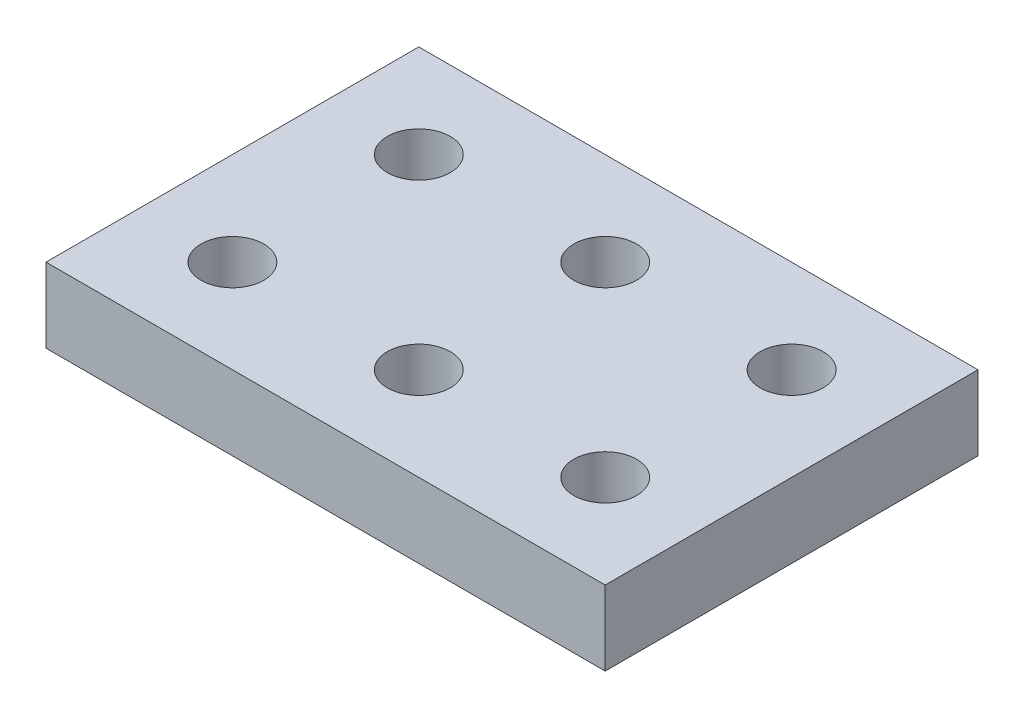
ISO-10303-21;
HEADER;
FILE_DESCRIPTION(('STEP AP214'),'2;1');
FILE_NAME('part.step','',(''),(''),'','','');
FILE_SCHEMA(('AUTOMOTIVE_DESIGN { 1 0 10303 214 1 1 1 1 }'));
ENDSEC;
DATA;
#1=APPLICATION_CONTEXT('core data for automotive mechanical design processes');
#2=APPLICATION_PROTOCOL_DEFINITION('international standard','automotive_design',2000,#1);
#3=PRODUCT_CONTEXT('',#1,'mechanical');
#4=PRODUCT('Part','Part','',(#3));
#5=PRODUCT_RELATED_PRODUCT_CATEGORY('part','',(#4));
#6=PRODUCT_DEFINITION_FORMATION('','',#4);
#7=PRODUCT_DEFINITION_CONTEXT('part definition',#1,'design');
#8=PRODUCT_DEFINITION('design','',#6,#7);
#9=PRODUCT_DEFINITION_SHAPE('','',#8);
#10=(LENGTH_UNIT() NAMED_UNIT(*) SI_UNIT(.MILLI.,.METRE.));
#11=(NAMED_UNIT(*) PLANE_ANGLE_UNIT() SI_UNIT($,.RADIAN.));
#12=(NAMED_UNIT(*) SI_UNIT($,.STERADIAN.) SOLID_ANGLE_UNIT());
#13=UNCERTAINTY_MEASURE_WITH_UNIT(LENGTH_MEASURE(1.E-05),#10,'distance_accuracy_value','');
#14=(GEOMETRIC_REPRESENTATION_CONTEXT(3) GLOBAL_UNCERTAINTY_ASSIGNED_CONTEXT((#13)) GLOBAL_UNIT_ASSIGNED_CONTEXT((#10,
#11,#12)) REPRESENTATION_CONTEXT('',''));
#15=CARTESIAN_POINT('',(0.,0.,0.));
#16=DIRECTION('',(0.,0.,1.));
#17=DIRECTION('',(1.,0.,0.));
#18=AXIS2_PLACEMENT_3D('',#15,#16,#17);
#19=CARTESIAN_POINT('',(0.,32.,0.));
#20=DIRECTION('',(1.,0.,0.));
#21=DIRECTION('',(0.,0.,-1.));
#22=AXIS2_PLACEMENT_3D('',#19,#20,#21);
#23=PLANE('',#22);
#24=DIRECTION('',(0.,0.,1.));
#25=VECTOR('',#24,1.);
#26=CARTESIAN_POINT('',(0.,0.,0.));
#27=LINE('',#26,#25);
#28=CARTESIAN_POINT('',(0.,0.,-160.));
#29=VERTEX_POINT('',#28);
#30=CARTESIAN_POINT('',(0.,0.,0.));
#31=VERTEX_POINT('',#30);
#32=EDGE_CURVE('E97',#29,#31,#27,.T.);
#33=ORIENTED_EDGE('',*,*,#32,.T.);
#34=DIRECTION('',(0.,-1.,0.));
#35=VECTOR('',#34,1.);
#36=CARTESIAN_POINT('',(0.,32.,0.));
#37=LINE('',#36,#35);
#38=CARTESIAN_POINT('',(0.,32.,0.));
#39=VERTEX_POINT('',#38);
#40=EDGE_CURVE('E11',#39,#31,#37,.T.);
#41=ORIENTED_EDGE('',*,*,#40,.F.);
#42=DIRECTION('',(0.,0.,1.));
#43=VECTOR('',#42,1.);
#44=CARTESIAN_POINT('',(0.,32.,0.));
#45=LINE('',#44,#43);
#46=CARTESIAN_POINT('',(0.,32.,-160.));
#47=VERTEX_POINT('',#46);
#48=EDGE_CURVE('E85',#47,#39,#45,.T.);
#49=ORIENTED_EDGE('',*,*,#48,.F.);
#50=DIRECTION('',(0.,-1.,0.));
#51=VECTOR('',#50,1.);
#52=CARTESIAN_POINT('',(0.,32.,-160.));
#53=LINE('',#52,#51);
#54=EDGE_CURVE('E93',#47,#29,#53,.T.);
#55=ORIENTED_EDGE('',*,*,#54,.T.);
#56=EDGE_LOOP('',(#33,#41,#49,#55));
#57=FACE_BOUND('',#56,.T.);
#58=ADVANCED_FACE('F34',(#57),#23,.F.);
#59=CARTESIAN_POINT('',(0.,32.,0.));
#60=DIRECTION('',(0.,0.,-1.));
#61=DIRECTION('',(-1.,0.,0.));
#62=AXIS2_PLACEMENT_3D('',#59,#60,#61);
#63=PLANE('',#62);
#64=DIRECTION('',(1.,0.,0.));
#65=VECTOR('',#64,1.);
#66=CARTESIAN_POINT('',(0.,0.,0.));
#67=LINE('',#66,#65);
#68=CARTESIAN_POINT('',(240.,0.,0.));
#69=VERTEX_POINT('',#68);
#70=EDGE_CURVE('E89',#31,#69,#67,.T.);
#71=ORIENTED_EDGE('',*,*,#70,.T.);
#72=DIRECTION('',(0.,-1.,0.));
#73=VECTOR('',#72,1.);
#74=CARTESIAN_POINT('',(240.,32.,0.));
#75=LINE('',#74,#73);
#76=CARTESIAN_POINT('',(240.,32.,0.));
#77=VERTEX_POINT('',#76);
#78=EDGE_CURVE('E42',#77,#69,#75,.T.);
#79=ORIENTED_EDGE('',*,*,#78,.F.);
#80=DIRECTION('',(1.,0.,0.));
#81=VECTOR('',#80,1.);
#82=CARTESIAN_POINT('',(0.,32.,0.));
#83=LINE('',#82,#81);
#84=EDGE_CURVE('E80',#39,#77,#83,.T.);
#85=ORIENTED_EDGE('',*,*,#84,.F.);
#86=ORIENTED_EDGE('',*,*,#40,.T.);
#87=EDGE_LOOP('',(#71,#79,#85,#86));
#88=FACE_BOUND('',#87,.T.);
#89=ADVANCED_FACE('F88',(#88),#63,.F.);
#90=CARTESIAN_POINT('',(240.,32.,0.));
#91=DIRECTION('',(-1.,0.,0.));
#92=DIRECTION('',(0.,0.,1.));
#93=AXIS2_PLACEMENT_3D('',#90,#91,#92);
#94=PLANE('',#93);
#95=DIRECTION('',(0.,0.,-1.));
#96=VECTOR('',#95,1.);
#97=CARTESIAN_POINT('',(240.,0.,0.));
#98=LINE('',#97,#96);
#99=CARTESIAN_POINT('',(240.,0.,-160.));
#100=VERTEX_POINT('',#99);
#101=EDGE_CURVE('E67',#69,#100,#98,.T.);
#102=ORIENTED_EDGE('',*,*,#101,.T.);
#103=DIRECTION('',(0.,-1.,0.));
#104=VECTOR('',#103,1.);
#105=CARTESIAN_POINT('',(240.,32.,-160.));
#106=LINE('',#105,#104);
#107=CARTESIAN_POINT('',(240.,32.,-160.));
#108=VERTEX_POINT('',#107);
#109=EDGE_CURVE('E90',#108,#100,#106,.T.);
#110=ORIENTED_EDGE('',*,*,#109,.F.);
#111=DIRECTION('',(0.,0.,-1.));
#112=VECTOR('',#111,1.);
#113=CARTESIAN_POINT('',(240.,32.,0.));
#114=LINE('',#113,#112);
#115=EDGE_CURVE('E83',#77,#108,#114,.T.);
#116=ORIENTED_EDGE('',*,*,#115,.F.);
#117=ORIENTED_EDGE('',*,*,#78,.T.);
#118=EDGE_LOOP('',(#102,#110,#116,#117));
#119=FACE_BOUND('',#118,.T.);
#120=ADVANCED_FACE('F91',(#119),#94,.F.);
#121=CARTESIAN_POINT('',(0.,32.,-160.));
#122=DIRECTION('',(0.,0.,1.));
#123=DIRECTION('',(1.,0.,0.));
#124=AXIS2_PLACEMENT_3D('',#121,#122,#123);
#125=PLANE('',#124);
#126=DIRECTION('',(-1.,0.,0.));
#127=VECTOR('',#126,1.);
#128=CARTESIAN_POINT('',(0.,0.,-160.));
#129=LINE('',#128,#127);
#130=EDGE_CURVE('E73',#100,#29,#129,.T.);
#131=ORIENTED_EDGE('',*,*,#130,.T.);
#132=ORIENTED_EDGE('',*,*,#54,.F.);
#133=DIRECTION('',(-1.,0.,0.));
#134=VECTOR('',#133,1.);
#135=CARTESIAN_POINT('',(0.,32.,-160.));
#136=LINE('',#135,#134);
#137=EDGE_CURVE('E50',#108,#47,#136,.T.);
#138=ORIENTED_EDGE('',*,*,#137,.F.);
#139=ORIENTED_EDGE('',*,*,#109,.T.);
#140=EDGE_LOOP('',(#131,#132,#138,#139));
#141=FACE_BOUND('',#140,.T.);
#142=ADVANCED_FACE('F105',(#141),#125,.F.);
#143=CARTESIAN_POINT('',(0.,32.,0.));
#144=DIRECTION('',(0.,-1.,0.));
#145=DIRECTION('',(0.,0.,-1.));
#146=AXIS2_PLACEMENT_3D('',#143,#144,#145);
#147=PLANE('',#146);
#148=CARTESIAN_POINT('',(200.,32.,-40.));
#149=DIRECTION('',(0.,1.,0.));
#150=DIRECTION('',(0.,0.,1.));
#151=AXIS2_PLACEMENT_3D('',#148,#149,#150);
#152=CIRCLE('',#151,13.5);
#153=CARTESIAN_POINT('',(200.,32.,-26.5));
#154=VERTEX_POINT('',#153);
#155=EDGE_CURVE('E141',#154,#154,#152,.T.);
#156=ORIENTED_EDGE('',*,*,#155,.F.);
#157=EDGE_LOOP('',(#156));
#158=FACE_BOUND('',#157,.T.);
#159=CARTESIAN_POINT('',(40.0000000000001,32.,-40.));
#160=DIRECTION('',(0.,1.,0.));
#161=DIRECTION('',(0.,0.,1.));
#162=AXIS2_PLACEMENT_3D('',#159,#160,#161);
#163=CIRCLE('',#162,13.5);
#164=CARTESIAN_POINT('',(40.0000000000001,32.,-26.5));
#165=VERTEX_POINT('',#164);
#166=EDGE_CURVE('E135',#165,#165,#163,.T.);
#167=ORIENTED_EDGE('',*,*,#166,.F.);
#168=EDGE_LOOP('',(#167));
#169=FACE_BOUND('',#168,.T.);
#170=CARTESIAN_POINT('',(120.,32.,-40.));
#171=DIRECTION('',(0.,1.,0.));
#172=DIRECTION('',(0.,0.,1.));
#173=AXIS2_PLACEMENT_3D('',#170,#171,#172);
#174=CIRCLE('',#173,13.5);
#175=CARTESIAN_POINT('',(120.,32.,-26.5));
#176=VERTEX_POINT('',#175);
#177=EDGE_CURVE('E129',#176,#176,#174,.T.);
#178=ORIENTED_EDGE('',*,*,#177,.F.);
#179=EDGE_LOOP('',(#178));
#180=FACE_BOUND('',#179,.T.);
#181=CARTESIAN_POINT('',(200.,32.,-120.));
#182=DIRECTION('',(0.,1.,0.));
#183=DIRECTION('',(0.,0.,1.));
#184=AXIS2_PLACEMENT_3D('',#181,#182,#183);
#185=CIRCLE('',#184,13.5);
#186=CARTESIAN_POINT('',(200.,32.,-106.5));
#187=VERTEX_POINT('',#186);
#188=EDGE_CURVE('E123',#187,#187,#185,.T.);
#189=ORIENTED_EDGE('',*,*,#188,.F.);
#190=EDGE_LOOP('',(#189));
#191=FACE_BOUND('',#190,.T.);
#192=CARTESIAN_POINT('',(40.0000000000001,32.,-120.));
#193=DIRECTION('',(0.,1.,0.));
#194=DIRECTION('',(0.,0.,1.));
#195=AXIS2_PLACEMENT_3D('',#192,#193,#194);
#196=CIRCLE('',#195,13.5);
#197=CARTESIAN_POINT('',(40.0000000000001,32.,-106.5));
#198=VERTEX_POINT('',#197);
#199=EDGE_CURVE('E117',#198,#198,#196,.T.);
#200=ORIENTED_EDGE('',*,*,#199,.F.);
#201=EDGE_LOOP('',(#200));
#202=FACE_BOUND('',#201,.T.);
#203=CARTESIAN_POINT('',(120.,32.,-120.));
#204=DIRECTION('',(0.,1.,0.));
#205=DIRECTION('',(0.,0.,1.));
#206=AXIS2_PLACEMENT_3D('',#203,#204,#205);
#207=CIRCLE('',#206,13.5);
#208=CARTESIAN_POINT('',(120.,32.,-106.5));
#209=VERTEX_POINT('',#208);
#210=EDGE_CURVE('E111',#209,#209,#207,.T.);
#211=ORIENTED_EDGE('',*,*,#210,.F.);
#212=EDGE_LOOP('',(#211));
#213=FACE_BOUND('',#212,.T.);
#214=ORIENTED_EDGE('',*,*,#48,.T.);
#215=ORIENTED_EDGE('',*,*,#84,.T.);
#216=ORIENTED_EDGE('',*,*,#115,.T.);
#217=ORIENTED_EDGE('',*,*,#137,.T.);
#218=EDGE_LOOP('',(#214,#215,#216,#217));
#219=FACE_BOUND('',#218,.T.);
#220=ADVANCED_FACE('F81',(#158,#169,#180,#191,#202,#213,#219),#147,.F.);
#221=CARTESIAN_POINT('',(0.,0.,0.));
#222=DIRECTION('',(0.,-1.,0.));
#223=DIRECTION('',(0.,0.,-1.));
#224=AXIS2_PLACEMENT_3D('',#221,#222,#223);
#225=PLANE('',#224);
#226=CARTESIAN_POINT('',(200.,0.,-40.));
#227=DIRECTION('',(0.,1.,0.));
#228=DIRECTION('',(0.,0.,1.));
#229=AXIS2_PLACEMENT_3D('',#226,#227,#228);
#230=CIRCLE('',#229,13.5);
#231=CARTESIAN_POINT('',(200.,0.,-26.5));
#232=VERTEX_POINT('',#231);
#233=EDGE_CURVE('E138',#232,#232,#230,.T.);
#234=ORIENTED_EDGE('',*,*,#233,.T.);
#235=EDGE_LOOP('',(#234));
#236=FACE_BOUND('',#235,.T.);
#237=CARTESIAN_POINT('',(40.0000000000001,0.,-40.));
#238=DIRECTION('',(0.,1.,0.));
#239=DIRECTION('',(0.,0.,1.));
#240=AXIS2_PLACEMENT_3D('',#237,#238,#239);
#241=CIRCLE('',#240,13.5);
#242=CARTESIAN_POINT('',(40.0000000000001,0.,-26.5));
#243=VERTEX_POINT('',#242);
#244=EDGE_CURVE('E132',#243,#243,#241,.T.);
#245=ORIENTED_EDGE('',*,*,#244,.T.);
#246=EDGE_LOOP('',(#245));
#247=FACE_BOUND('',#246,.T.);
#248=CARTESIAN_POINT('',(120.,0.,-40.));
#249=DIRECTION('',(0.,1.,0.));
#250=DIRECTION('',(0.,0.,1.));
#251=AXIS2_PLACEMENT_3D('',#248,#249,#250);
#252=CIRCLE('',#251,13.5);
#253=CARTESIAN_POINT('',(120.,0.,-26.5));
#254=VERTEX_POINT('',#253);
#255=EDGE_CURVE('E126',#254,#254,#252,.T.);
#256=ORIENTED_EDGE('',*,*,#255,.T.);
#257=EDGE_LOOP('',(#256));
#258=FACE_BOUND('',#257,.T.);
#259=CARTESIAN_POINT('',(200.,0.,-120.));
#260=DIRECTION('',(0.,1.,0.));
#261=DIRECTION('',(0.,0.,1.));
#262=AXIS2_PLACEMENT_3D('',#259,#260,#261);
#263=CIRCLE('',#262,13.5);
#264=CARTESIAN_POINT('',(200.,0.,-106.5));
#265=VERTEX_POINT('',#264);
#266=EDGE_CURVE('E120',#265,#265,#263,.T.);
#267=ORIENTED_EDGE('',*,*,#266,.T.);
#268=EDGE_LOOP('',(#267));
#269=FACE_BOUND('',#268,.T.);
#270=CARTESIAN_POINT('',(40.0000000000001,0.,-120.));
#271=DIRECTION('',(0.,1.,0.));
#272=DIRECTION('',(0.,0.,1.));
#273=AXIS2_PLACEMENT_3D('',#270,#271,#272);
#274=CIRCLE('',#273,13.5);
#275=CARTESIAN_POINT('',(40.0000000000001,0.,-106.5));
#276=VERTEX_POINT('',#275);
#277=EDGE_CURVE('E114',#276,#276,#274,.T.);
#278=ORIENTED_EDGE('',*,*,#277,.T.);
#279=EDGE_LOOP('',(#278));
#280=FACE_BOUND('',#279,.T.);
#281=CARTESIAN_POINT('',(120.,0.,-120.));
#282=DIRECTION('',(0.,1.,0.));
#283=DIRECTION('',(0.,0.,1.));
#284=AXIS2_PLACEMENT_3D('',#281,#282,#283);
#285=CIRCLE('',#284,13.5);
#286=CARTESIAN_POINT('',(120.,0.,-106.5));
#287=VERTEX_POINT('',#286);
#288=EDGE_CURVE('E100',#287,#287,#285,.T.);
#289=ORIENTED_EDGE('',*,*,#288,.T.);
#290=EDGE_LOOP('',(#289));
#291=FACE_BOUND('',#290,.T.);
#292=ORIENTED_EDGE('',*,*,#32,.F.);
#293=ORIENTED_EDGE('',*,*,#130,.F.);
#294=ORIENTED_EDGE('',*,*,#101,.F.);
#295=ORIENTED_EDGE('',*,*,#70,.F.);
#296=EDGE_LOOP('',(#292,#293,#294,#295));
#297=FACE_BOUND('',#296,.T.);
#298=ADVANCED_FACE('F108',(#236,#247,#258,#269,#280,#291,#297),#225,.T.);
#299=CARTESIAN_POINT('',(120.,0.,-120.));
#300=DIRECTION('',(0.,1.,0.));
#301=DIRECTION('',(0.,0.,1.));
#302=AXIS2_PLACEMENT_3D('',#299,#300,#301);
#303=CYLINDRICAL_SURFACE('',#302,13.5);
#304=ORIENTED_EDGE('',*,*,#288,.F.);
#305=EDGE_LOOP('',(#304));
#306=FACE_BOUND('',#305,.T.);
#307=ORIENTED_EDGE('',*,*,#210,.T.);
#308=EDGE_LOOP('',(#307));
#309=FACE_BOUND('',#308,.T.);
#310=ADVANCED_FACE('F169',(#306,#309),#303,.F.);
#311=CARTESIAN_POINT('',(40.0000000000001,0.,-120.));
#312=DIRECTION('',(0.,1.,0.));
#313=DIRECTION('',(0.,0.,1.));
#314=AXIS2_PLACEMENT_3D('',#311,#312,#313);
#315=CYLINDRICAL_SURFACE('',#314,13.5);
#316=ORIENTED_EDGE('',*,*,#277,.F.);
#317=EDGE_LOOP('',(#316));
#318=FACE_BOUND('',#317,.T.);
#319=ORIENTED_EDGE('',*,*,#199,.T.);
#320=EDGE_LOOP('',(#319));
#321=FACE_BOUND('',#320,.T.);
#322=ADVANCED_FACE('F171',(#318,#321),#315,.F.);
#323=CARTESIAN_POINT('',(200.,0.,-120.));
#324=DIRECTION('',(0.,1.,0.));
#325=DIRECTION('',(0.,0.,1.));
#326=AXIS2_PLACEMENT_3D('',#323,#324,#325);
#327=CYLINDRICAL_SURFACE('',#326,13.5);
#328=ORIENTED_EDGE('',*,*,#266,.F.);
#329=EDGE_LOOP('',(#328));
#330=FACE_BOUND('',#329,.T.);
#331=ORIENTED_EDGE('',*,*,#188,.T.);
#332=EDGE_LOOP('',(#331));
#333=FACE_BOUND('',#332,.T.);
#334=ADVANCED_FACE('F178',(#330,#333),#327,.F.);
#335=CARTESIAN_POINT('',(120.,0.,-40.));
#336=DIRECTION('',(0.,1.,0.));
#337=DIRECTION('',(0.,0.,1.));
#338=AXIS2_PLACEMENT_3D('',#335,#336,#337);
#339=CYLINDRICAL_SURFACE('',#338,13.5);
#340=ORIENTED_EDGE('',*,*,#255,.F.);
#341=EDGE_LOOP('',(#340));
#342=FACE_BOUND('',#341,.T.);
#343=ORIENTED_EDGE('',*,*,#177,.T.);
#344=EDGE_LOOP('',(#343));
#345=FACE_BOUND('',#344,.T.);
#346=ADVANCED_FACE('F212',(#342,#345),#339,.F.);
#347=CARTESIAN_POINT('',(40.0000000000001,0.,-40.));
#348=DIRECTION('',(0.,1.,0.));
#349=DIRECTION('',(0.,0.,1.));
#350=AXIS2_PLACEMENT_3D('',#347,#348,#349);
#351=CYLINDRICAL_SURFACE('',#350,13.5);
#352=ORIENTED_EDGE('',*,*,#244,.F.);
#353=EDGE_LOOP('',(#352));
#354=FACE_BOUND('',#353,.T.);
#355=ORIENTED_EDGE('',*,*,#166,.T.);
#356=EDGE_LOOP('',(#355));
#357=FACE_BOUND('',#356,.T.);
#358=ADVANCED_FACE('F152',(#354,#357),#351,.F.);
#359=CARTESIAN_POINT('',(200.,0.,-40.));
#360=DIRECTION('',(0.,1.,0.));
#361=DIRECTION('',(0.,0.,1.));
#362=AXIS2_PLACEMENT_3D('',#359,#360,#361);
#363=CYLINDRICAL_SURFACE('',#362,13.5);
#364=ORIENTED_EDGE('',*,*,#233,.F.);
#365=EDGE_LOOP('',(#364));
#366=FACE_BOUND('',#365,.T.);
#367=ORIENTED_EDGE('',*,*,#155,.T.);
#368=EDGE_LOOP('',(#367));
#369=FACE_BOUND('',#368,.T.);
#370=ADVANCED_FACE('F149',(#366,#369),#363,.F.);
#371=CLOSED_SHELL('',(#58,#89,#120,#142,#220,#298,#310,#322,#334,#346,#358,#370));
#372=MANIFOLD_SOLID_BREP('B2',#371);
#373=ADVANCED_BREP_SHAPE_REPRESENTATION('',(#18,#372),#14);
#374=SHAPE_DEFINITION_REPRESENTATION(#9,#373);
ENDSEC;
END-ISO-10303-21;
